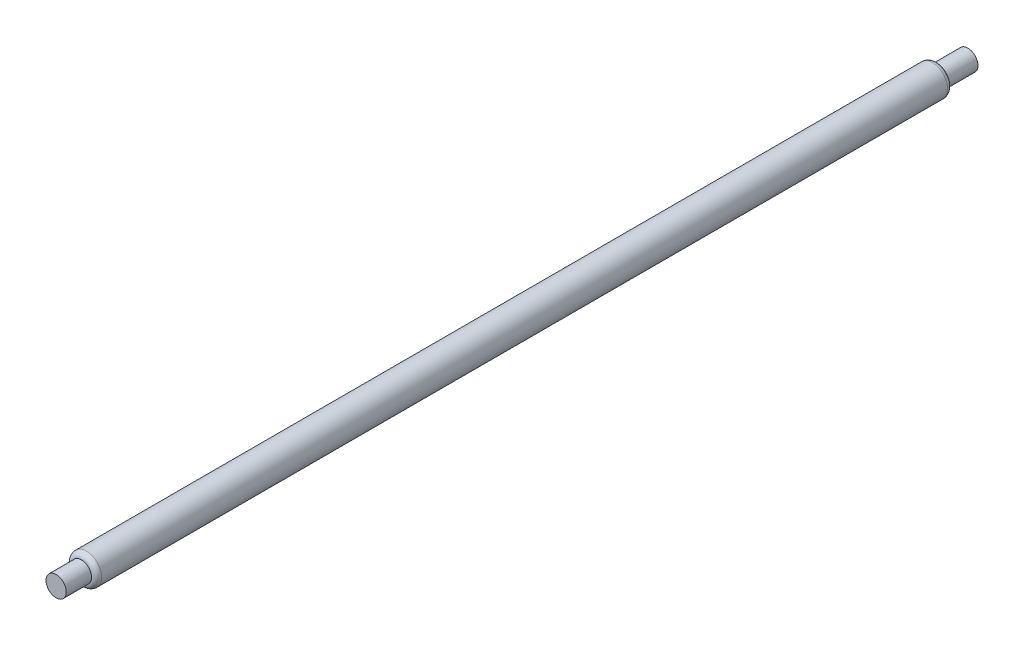
ISO-10303-21;
HEADER;
FILE_DESCRIPTION(('STEP AP214'),'2;1');
FILE_NAME('part.step','',(''),(''),'','','');
FILE_SCHEMA(('AUTOMOTIVE_DESIGN { 1 0 10303 214 1 1 1 1 }'));
ENDSEC;
DATA;
#1=APPLICATION_CONTEXT('core data for automotive mechanical design processes');
#2=APPLICATION_PROTOCOL_DEFINITION('international standard','automotive_design',2000,#1);
#3=PRODUCT_CONTEXT('',#1,'mechanical');
#4=PRODUCT('Part','Part','',(#3));
#5=PRODUCT_RELATED_PRODUCT_CATEGORY('part','',(#4));
#6=PRODUCT_DEFINITION_FORMATION('','',#4);
#7=PRODUCT_DEFINITION_CONTEXT('part definition',#1,'design');
#8=PRODUCT_DEFINITION('design','',#6,#7);
#9=PRODUCT_DEFINITION_SHAPE('','',#8);
#10=(LENGTH_UNIT() NAMED_UNIT(*) SI_UNIT(.MILLI.,.METRE.));
#11=(NAMED_UNIT(*) PLANE_ANGLE_UNIT() SI_UNIT($,.RADIAN.));
#12=(NAMED_UNIT(*) SI_UNIT($,.STERADIAN.) SOLID_ANGLE_UNIT());
#13=UNCERTAINTY_MEASURE_WITH_UNIT(LENGTH_MEASURE(1.E-05),#10,'distance_accuracy_value','');
#14=(GEOMETRIC_REPRESENTATION_CONTEXT(3) GLOBAL_UNCERTAINTY_ASSIGNED_CONTEXT((#13)) GLOBAL_UNIT_ASSIGNED_CONTEXT((#10,
#11,#12)) REPRESENTATION_CONTEXT('',''));
#15=CARTESIAN_POINT('',(0.,0.,0.));
#16=DIRECTION('',(0.,0.,1.));
#17=DIRECTION('',(1.,0.,0.));
#18=AXIS2_PLACEMENT_3D('',#15,#16,#17);
#19=CARTESIAN_POINT('',(0.,0.,180.));
#20=DIRECTION('',(0.,0.,-1.));
#21=DIRECTION('',(-1.,0.,0.));
#22=AXIS2_PLACEMENT_3D('',#19,#20,#21);
#23=CYLINDRICAL_SURFACE('',#22,6.);
#24=CARTESIAN_POINT('',(0.,0.,-166.));
#25=DIRECTION('',(0.,0.,-1.));
#26=DIRECTION('',(-1.,0.,0.));
#27=AXIS2_PLACEMENT_3D('',#24,#25,#26);
#28=CIRCLE('',#27,6.);
#29=CARTESIAN_POINT('',(-6.,0.,-166.));
#30=VERTEX_POINT('',#29);
#31=EDGE_CURVE('E11',#30,#30,#28,.F.);
#32=CARTESIAN_POINT('',(0.,0.,168.));
#33=DIRECTION('',(0.,0.,1.));
#34=DIRECTION('',(1.,0.,0.));
#35=AXIS2_PLACEMENT_3D('',#32,#33,#34);
#36=CIRCLE('',#35,6.);
#37=CARTESIAN_POINT('',(-6.,0.,168.));
#38=VERTEX_POINT('',#37);
#39=EDGE_CURVE('E40',#38,#38,#36,.F.);
#40=CARTESIAN_POINT('',(-6.,0.,-166.));
#41=CARTESIAN_POINT('',(-6.,0.,-162.520833333333));
#42=CARTESIAN_POINT('',(-6.,0.,-159.041666666667));
#43=CARTESIAN_POINT('',(-6.,0.,-152.083333333333));
#44=CARTESIAN_POINT('',(-6.,0.,-148.604166666667));
#45=CARTESIAN_POINT('',(-6.,0.,-141.645833333333));
#46=CARTESIAN_POINT('',(-6.,0.,-138.166666666667));
#47=CARTESIAN_POINT('',(-6.,0.,-131.208333333333));
#48=CARTESIAN_POINT('',(-6.,0.,-127.729166666667));
#49=CARTESIAN_POINT('',(-6.,0.,-120.770833333333));
#50=CARTESIAN_POINT('',(-6.,0.,-117.291666666667));
#51=CARTESIAN_POINT('',(-6.,0.,-110.333333333333));
#52=CARTESIAN_POINT('',(-6.,0.,-106.854166666667));
#53=CARTESIAN_POINT('',(-6.,0.,-99.8958333333333));
#54=CARTESIAN_POINT('',(-6.,0.,-96.4166666666667));
#55=CARTESIAN_POINT('',(-6.,0.,-89.4583333333333));
#56=CARTESIAN_POINT('',(-6.,0.,-85.9791666666667));
#57=CARTESIAN_POINT('',(-6.,0.,-79.0208333333334));
#58=CARTESIAN_POINT('',(-6.,0.,-75.5416666666667));
#59=CARTESIAN_POINT('',(-6.,0.,-68.5833333333334));
#60=CARTESIAN_POINT('',(-6.,0.,-65.1041666666667));
#61=CARTESIAN_POINT('',(-6.,0.,-58.1458333333334));
#62=CARTESIAN_POINT('',(-6.,0.,-54.6666666666667));
#63=CARTESIAN_POINT('',(-6.,0.,-47.7083333333334));
#64=CARTESIAN_POINT('',(-6.,0.,-44.2291666666667));
#65=CARTESIAN_POINT('',(-6.,0.,-37.2708333333334));
#66=CARTESIAN_POINT('',(-6.,0.,-33.7916666666667));
#67=CARTESIAN_POINT('',(-6.,0.,-26.8333333333334));
#68=CARTESIAN_POINT('',(-6.,0.,-23.3541666666667));
#69=CARTESIAN_POINT('',(-6.,0.,-16.3958333333334));
#70=CARTESIAN_POINT('',(-6.,0.,-12.9166666666667));
#71=CARTESIAN_POINT('',(-6.,0.,-5.95833333333335));
#72=CARTESIAN_POINT('',(-6.,0.,-2.47916666666669));
#73=CARTESIAN_POINT('',(-6.,0.,4.47916666666664));
#74=CARTESIAN_POINT('',(-6.,0.,7.9583333333333));
#75=CARTESIAN_POINT('',(-6.,0.,14.9166666666666));
#76=CARTESIAN_POINT('',(-6.,0.,18.3958333333333));
#77=CARTESIAN_POINT('',(-6.,0.,25.3541666666667));
#78=CARTESIAN_POINT('',(-6.,0.,28.8333333333333));
#79=CARTESIAN_POINT('',(-6.,0.,35.7916666666667));
#80=CARTESIAN_POINT('',(-6.,0.,39.2708333333333));
#81=CARTESIAN_POINT('',(-6.,0.,46.2291666666667));
#82=CARTESIAN_POINT('',(-6.,0.,49.7083333333333));
#83=CARTESIAN_POINT('',(-6.,0.,56.6666666666666));
#84=CARTESIAN_POINT('',(-6.,0.,60.1458333333333));
#85=CARTESIAN_POINT('',(-6.,0.,67.1041666666666));
#86=CARTESIAN_POINT('',(-6.,0.,70.5833333333333));
#87=CARTESIAN_POINT('',(-6.,0.,77.5416666666666));
#88=CARTESIAN_POINT('',(-6.,0.,81.0208333333333));
#89=CARTESIAN_POINT('',(-6.,0.,87.9791666666666));
#90=CARTESIAN_POINT('',(-6.,0.,91.4583333333333));
#91=CARTESIAN_POINT('',(-6.,0.,98.4166666666666));
#92=CARTESIAN_POINT('',(-6.,0.,101.895833333333));
#93=CARTESIAN_POINT('',(-6.,0.,108.854166666667));
#94=CARTESIAN_POINT('',(-6.,0.,112.333333333333));
#95=CARTESIAN_POINT('',(-6.,0.,119.291666666667));
#96=CARTESIAN_POINT('',(-6.,0.,122.770833333333));
#97=CARTESIAN_POINT('',(-6.,0.,129.729166666667));
#98=CARTESIAN_POINT('',(-6.,0.,133.208333333333));
#99=CARTESIAN_POINT('',(-6.,0.,140.166666666667));
#100=CARTESIAN_POINT('',(-6.,0.,143.645833333333));
#101=CARTESIAN_POINT('',(-6.,0.,150.604166666667));
#102=CARTESIAN_POINT('',(-6.,0.,154.083333333333));
#103=CARTESIAN_POINT('',(-6.,0.,161.041666666667));
#104=CARTESIAN_POINT('',(-6.,0.,164.520833333333));
#105=CARTESIAN_POINT('',(-6.,0.,168.));
#106=B_SPLINE_CURVE_WITH_KNOTS('',3,(#40,#41,#42,#43,#44,#45,#46,#47,#48,#49,#50,#51,#52,#53,
#54,#55,#56,#57,#58,#59,#60,#61,#62,#63,#64,#65,#66,#67,#68,#69,#70,#71,#72,#73,#74,#75,#76,#77,
#78,#79,#80,#81,#82,#83,#84,#85,#86,#87,#88,#89,#90,#91,#92,#93,#94,#95,#96,#97,#98,#99,#100,
#101,#102,#103,#104,#105),.UNSPECIFIED.,.F.,.F.,(4,2,2,2,2,2,2,2,2,2,2,2,2,2,2,2,2,2,2,2,2,2,2,
2,2,2,2,2,2,2,2,2,4),(0.,10.4375,20.875,31.3125,41.75,52.1875,62.625,73.0625,83.5,93.9375,
104.375,114.8125,125.25,135.6875,146.125,156.5625,167.,177.4375,187.875,198.3125,208.75,
219.1875,229.625,240.0625,250.5,260.9375,271.375,281.8125,292.25,302.6875,313.125,323.5625,
334.),.UNSPECIFIED.);
#107=EDGE_CURVE('BSEAM33',#30,#38,#106,.T.);
#108=ORIENTED_EDGE('',*,*,#31,.T.);
#109=ORIENTED_EDGE('',*,*,#39,.T.);
#110=ORIENTED_EDGE('',*,*,#107,.T.);
#111=ORIENTED_EDGE('',*,*,#107,.F.);
#112=EDGE_LOOP('',(#108,#110,#109,#111));
#113=FACE_BOUND('',#112,.T.);
#114=ADVANCED_FACE('F33',(#113),#23,.T.);
#115=CARTESIAN_POINT('',(0.,0.,170.));
#116=DIRECTION('',(0.,0.,1.));
#117=DIRECTION('',(1.,0.,0.));
#118=AXIS2_PLACEMENT_3D('',#115,#116,#117);
#119=CYLINDRICAL_SURFACE('',#118,4.);
#120=CARTESIAN_POINT('',(0.,0.,170.));
#121=DIRECTION('',(0.,0.,1.));
#122=DIRECTION('',(1.,0.,0.));
#123=AXIS2_PLACEMENT_3D('',#120,#121,#122);
#124=CIRCLE('',#123,4.);
#125=CARTESIAN_POINT('',(4.,0.,170.));
#126=VERTEX_POINT('',#125);
#127=EDGE_CURVE('E44',#126,#126,#124,.T.);
#128=ORIENTED_EDGE('',*,*,#127,.T.);
#129=EDGE_LOOP('',(#128));
#130=FACE_BOUND('',#129,.T.);
#131=CARTESIAN_POINT('',(0.,0.,180.));
#132=DIRECTION('',(0.,0.,1.));
#133=DIRECTION('',(1.,0.,0.));
#134=AXIS2_PLACEMENT_3D('',#131,#132,#133);
#135=CIRCLE('',#134,4.);
#136=CARTESIAN_POINT('',(4.,0.,180.));
#137=VERTEX_POINT('',#136);
#138=EDGE_CURVE('E49',#137,#137,#135,.T.);
#139=ORIENTED_EDGE('',*,*,#138,.F.);
#140=EDGE_LOOP('',(#139));
#141=FACE_BOUND('',#140,.T.);
#142=ADVANCED_FACE('F79',(#130,#141),#119,.T.);
#143=CARTESIAN_POINT('',(0.,0.,180.));
#144=DIRECTION('',(0.,0.,1.));
#145=DIRECTION('',(1.,0.,0.));
#146=AXIS2_PLACEMENT_3D('',#143,#144,#145);
#147=PLANE('',#146);
#148=ORIENTED_EDGE('',*,*,#138,.T.);
#149=EDGE_LOOP('',(#148));
#150=FACE_BOUND('',#149,.T.);
#151=ADVANCED_FACE('F83',(#150),#147,.T.);
#152=CARTESIAN_POINT('',(0.,0.,168.));
#153=DIRECTION('',(0.,0.,1.));
#154=DIRECTION('',(1.,0.,0.));
#155=AXIS2_PLACEMENT_3D('',#152,#153,#154);
#156=TOROIDAL_SURFACE('',#155,4.,2.);
#157=ORIENTED_EDGE('',*,*,#39,.F.);
#158=EDGE_LOOP('',(#157));
#159=FACE_BOUND('',#158,.T.);
#160=ORIENTED_EDGE('',*,*,#127,.F.);
#161=EDGE_LOOP('',(#160));
#162=FACE_BOUND('',#161,.T.);
#163=ADVANCED_FACE('F73',(#159,#162),#156,.T.);
#164=CARTESIAN_POINT('',(0.,0.,-170.));
#165=DIRECTION('',(0.,0.,-1.));
#166=DIRECTION('',(-1.,0.,0.));
#167=AXIS2_PLACEMENT_3D('',#164,#165,#166);
#168=CYLINDRICAL_SURFACE('',#167,4.);
#169=CARTESIAN_POINT('',(0.,0.,-168.));
#170=DIRECTION('',(0.,0.,1.));
#171=DIRECTION('',(1.,0.,0.));
#172=AXIS2_PLACEMENT_3D('',#169,#170,#171);
#173=CIRCLE('',#172,4.);
#174=CARTESIAN_POINT('',(4.,0.,-168.));
#175=VERTEX_POINT('',#174);
#176=EDGE_CURVE('E52',#175,#175,#173,.T.);
#177=ORIENTED_EDGE('',*,*,#176,.F.);
#178=EDGE_LOOP('',(#177));
#179=FACE_BOUND('',#178,.T.);
#180=CARTESIAN_POINT('',(0.,0.,-180.));
#181=DIRECTION('',(0.,0.,1.));
#182=DIRECTION('',(1.,0.,0.));
#183=AXIS2_PLACEMENT_3D('',#180,#181,#182);
#184=CIRCLE('',#183,4.);
#185=CARTESIAN_POINT('',(4.,0.,-180.));
#186=VERTEX_POINT('',#185);
#187=EDGE_CURVE('E54',#186,#186,#184,.T.);
#188=ORIENTED_EDGE('',*,*,#187,.T.);
#189=EDGE_LOOP('',(#188));
#190=FACE_BOUND('',#189,.T.);
#191=ADVANCED_FACE('F62',(#179,#190),#168,.T.);
#192=CARTESIAN_POINT('',(0.,0.,-180.));
#193=DIRECTION('',(0.,0.,1.));
#194=DIRECTION('',(1.,0.,0.));
#195=AXIS2_PLACEMENT_3D('',#192,#193,#194);
#196=PLANE('',#195);
#197=ORIENTED_EDGE('',*,*,#187,.F.);
#198=EDGE_LOOP('',(#197));
#199=FACE_BOUND('',#198,.T.);
#200=ADVANCED_FACE('F64',(#199),#196,.F.);
#201=CARTESIAN_POINT('',(0.,0.,-166.));
#202=DIRECTION('',(0.,0.,-1.));
#203=DIRECTION('',(-1.,0.,0.));
#204=AXIS2_PLACEMENT_3D('',#201,#202,#203);
#205=TOROIDAL_SURFACE('',#204,4.,2.);
#206=ORIENTED_EDGE('',*,*,#176,.T.);
#207=EDGE_LOOP('',(#206));
#208=FACE_BOUND('',#207,.T.);
#209=ORIENTED_EDGE('',*,*,#31,.F.);
#210=EDGE_LOOP('',(#209));
#211=FACE_BOUND('',#210,.T.);
#212=ADVANCED_FACE('F35',(#208,#211),#205,.T.);
#213=CLOSED_SHELL('',(#114,#142,#151,#163,#191,#200,#212));
#214=MANIFOLD_SOLID_BREP('B2',#213);
#215=ADVANCED_BREP_SHAPE_REPRESENTATION('',(#18,#214),#14);
#216=SHAPE_DEFINITION_REPRESENTATION(#9,#215);
ENDSEC;
END-ISO-10303-21;
